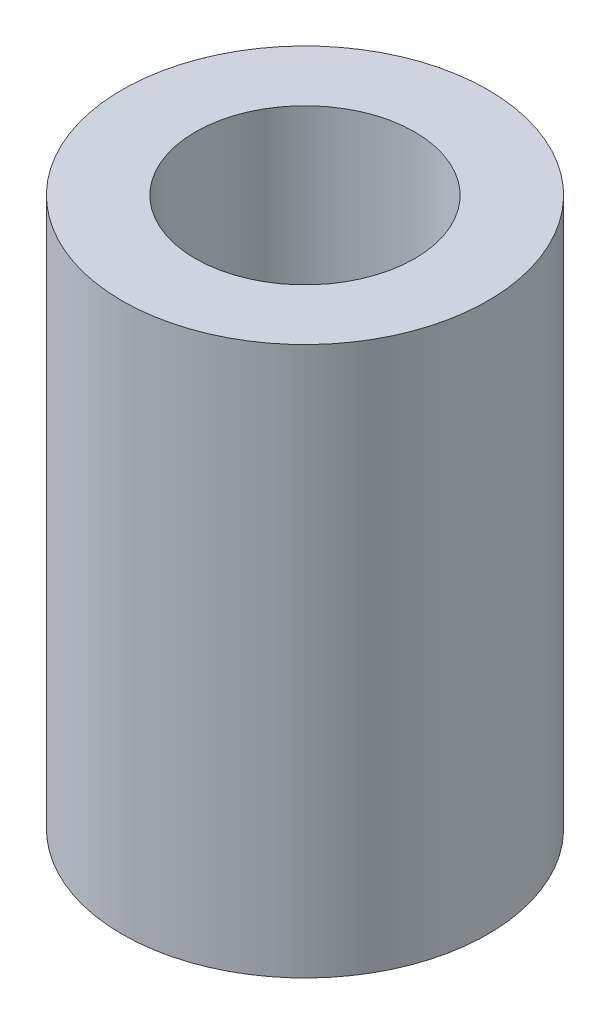
ISO-10303-21;
HEADER;
FILE_DESCRIPTION(('STEP AP214'),'2;1');
FILE_NAME('part.step','',(''),(''),'','','');
FILE_SCHEMA(('AUTOMOTIVE_DESIGN { 1 0 10303 214 1 1 1 1 }'));
ENDSEC;
DATA;
#1=APPLICATION_CONTEXT('core data for automotive mechanical design processes');
#2=APPLICATION_PROTOCOL_DEFINITION('international standard','automotive_design',2000,#1);
#3=PRODUCT_CONTEXT('',#1,'mechanical');
#4=PRODUCT('Part','Part','',(#3));
#5=PRODUCT_RELATED_PRODUCT_CATEGORY('part','',(#4));
#6=PRODUCT_DEFINITION_FORMATION('','',#4);
#7=PRODUCT_DEFINITION_CONTEXT('part definition',#1,'design');
#8=PRODUCT_DEFINITION('design','',#6,#7);
#9=PRODUCT_DEFINITION_SHAPE('','',#8);
#10=(LENGTH_UNIT() NAMED_UNIT(*) SI_UNIT(.MILLI.,.METRE.));
#11=(NAMED_UNIT(*) PLANE_ANGLE_UNIT() SI_UNIT($,.RADIAN.));
#12=(NAMED_UNIT(*) SI_UNIT($,.STERADIAN.) SOLID_ANGLE_UNIT());
#13=UNCERTAINTY_MEASURE_WITH_UNIT(LENGTH_MEASURE(1.E-05),#10,'distance_accuracy_value','');
#14=(GEOMETRIC_REPRESENTATION_CONTEXT(3) GLOBAL_UNCERTAINTY_ASSIGNED_CONTEXT((#13)) GLOBAL_UNIT_ASSIGNED_CONTEXT((#10,
#11,#12)) REPRESENTATION_CONTEXT('',''));
#15=CARTESIAN_POINT('',(0.,0.,0.));
#16=DIRECTION('',(0.,0.,1.));
#17=DIRECTION('',(1.,0.,0.));
#18=AXIS2_PLACEMENT_3D('',#15,#16,#17);
#19=CARTESIAN_POINT('',(0.,30.,0.));
#20=DIRECTION('',(0.,-1.,0.));
#21=DIRECTION('',(0.,0.,-1.));
#22=AXIS2_PLACEMENT_3D('',#19,#20,#21);
#23=CYLINDRICAL_SURFACE('',#22,10.);
#24=CARTESIAN_POINT('',(0.,30.,0.));
#25=DIRECTION('',(0.,1.,0.));
#26=DIRECTION('',(0.,0.,1.));
#27=AXIS2_PLACEMENT_3D('',#24,#25,#26);
#28=CIRCLE('',#27,10.);
#29=CARTESIAN_POINT('',(0.,30.,10.));
#30=VERTEX_POINT('',#29);
#31=EDGE_CURVE('E10',#30,#30,#28,.T.);
#32=ORIENTED_EDGE('',*,*,#31,.F.);
#33=EDGE_LOOP('',(#32));
#34=FACE_BOUND('',#33,.T.);
#35=CARTESIAN_POINT('',(0.,0.,0.));
#36=DIRECTION('',(0.,1.,0.));
#37=DIRECTION('',(0.,0.,1.));
#38=AXIS2_PLACEMENT_3D('',#35,#36,#37);
#39=CIRCLE('',#38,10.);
#40=CARTESIAN_POINT('',(0.,0.,10.));
#41=VERTEX_POINT('',#40);
#42=EDGE_CURVE('E40',#41,#41,#39,.T.);
#43=ORIENTED_EDGE('',*,*,#42,.T.);
#44=EDGE_LOOP('',(#43));
#45=FACE_BOUND('',#44,.T.);
#46=ADVANCED_FACE('F37',(#34,#45),#23,.T.);
#47=CARTESIAN_POINT('',(0.,30.,0.));
#48=DIRECTION('',(0.,1.,0.));
#49=DIRECTION('',(0.,0.,1.));
#50=AXIS2_PLACEMENT_3D('',#47,#48,#49);
#51=PLANE('',#50);
#52=CARTESIAN_POINT('',(0.,30.,0.));
#53=DIRECTION('',(0.,1.,0.));
#54=DIRECTION('',(0.,0.,1.));
#55=AXIS2_PLACEMENT_3D('',#52,#53,#54);
#56=CIRCLE('',#55,6.);
#57=CARTESIAN_POINT('',(0.,30.,6.));
#58=VERTEX_POINT('',#57);
#59=EDGE_CURVE('E51',#58,#58,#56,.T.);
#60=ORIENTED_EDGE('',*,*,#59,.F.);
#61=EDGE_LOOP('',(#60));
#62=FACE_BOUND('',#61,.T.);
#63=ORIENTED_EDGE('',*,*,#31,.T.);
#64=EDGE_LOOP('',(#63));
#65=FACE_BOUND('',#64,.T.);
#66=ADVANCED_FACE('F80',(#62,#65),#51,.T.);
#67=CARTESIAN_POINT('',(0.,0.,0.));
#68=DIRECTION('',(0.,1.,0.));
#69=DIRECTION('',(0.,0.,1.));
#70=AXIS2_PLACEMENT_3D('',#67,#68,#69);
#71=PLANE('',#70);
#72=CARTESIAN_POINT('',(0.,0.,0.));
#73=DIRECTION('',(0.,-1.,0.));
#74=DIRECTION('',(0.,0.,-1.));
#75=AXIS2_PLACEMENT_3D('',#72,#73,#74);
#76=CIRCLE('',#75,5.);
#77=CARTESIAN_POINT('',(0.,0.,-5.));
#78=VERTEX_POINT('',#77);
#79=EDGE_CURVE('E59',#78,#78,#76,.T.);
#80=ORIENTED_EDGE('',*,*,#79,.F.);
#81=EDGE_LOOP('',(#80));
#82=FACE_BOUND('',#81,.T.);
#83=ORIENTED_EDGE('',*,*,#42,.F.);
#84=EDGE_LOOP('',(#83));
#85=FACE_BOUND('',#84,.T.);
#86=ADVANCED_FACE('F76',(#82,#85),#71,.F.);
#87=CARTESIAN_POINT('',(0.,20.,0.));
#88=DIRECTION('',(0.,1.,0.));
#89=DIRECTION('',(0.,0.,1.));
#90=AXIS2_PLACEMENT_3D('',#87,#88,#89);
#91=CYLINDRICAL_SURFACE('',#90,6.);
#92=CARTESIAN_POINT('',(0.,20.,0.));
#93=DIRECTION('',(0.,1.,0.));
#94=DIRECTION('',(0.,0.,1.));
#95=AXIS2_PLACEMENT_3D('',#92,#93,#94);
#96=CIRCLE('',#95,6.);
#97=CARTESIAN_POINT('',(0.,20.,6.));
#98=VERTEX_POINT('',#97);
#99=EDGE_CURVE('E49',#98,#98,#96,.T.);
#100=ORIENTED_EDGE('',*,*,#99,.F.);
#101=EDGE_LOOP('',(#100));
#102=FACE_BOUND('',#101,.T.);
#103=ORIENTED_EDGE('',*,*,#59,.T.);
#104=EDGE_LOOP('',(#103));
#105=FACE_BOUND('',#104,.T.);
#106=ADVANCED_FACE('F79',(#102,#105),#91,.F.);
#107=CARTESIAN_POINT('',(0.,20.,0.));
#108=DIRECTION('',(0.,1.,0.));
#109=DIRECTION('',(0.,0.,1.));
#110=AXIS2_PLACEMENT_3D('',#107,#108,#109);
#111=PLANE('',#110);
#112=ORIENTED_EDGE('',*,*,#99,.T.);
#113=EDGE_LOOP('',(#112));
#114=FACE_BOUND('',#113,.T.);
#115=ADVANCED_FACE('F72',(#114),#111,.T.);
#116=CARTESIAN_POINT('',(0.,10.,0.));
#117=DIRECTION('',(0.,-1.,0.));
#118=DIRECTION('',(0.,0.,-1.));
#119=AXIS2_PLACEMENT_3D('',#116,#117,#118);
#120=CYLINDRICAL_SURFACE('',#119,5.);
#121=CARTESIAN_POINT('',(0.,10.,0.));
#122=DIRECTION('',(0.,-1.,0.));
#123=DIRECTION('',(0.,0.,-1.));
#124=AXIS2_PLACEMENT_3D('',#121,#122,#123);
#125=CIRCLE('',#124,5.);
#126=CARTESIAN_POINT('',(0.,10.,-5.));
#127=VERTEX_POINT('',#126);
#128=EDGE_CURVE('E55',#127,#127,#125,.T.);
#129=ORIENTED_EDGE('',*,*,#128,.F.);
#130=EDGE_LOOP('',(#129));
#131=FACE_BOUND('',#130,.T.);
#132=ORIENTED_EDGE('',*,*,#79,.T.);
#133=EDGE_LOOP('',(#132));
#134=FACE_BOUND('',#133,.T.);
#135=ADVANCED_FACE('F69',(#131,#134),#120,.F.);
#136=CARTESIAN_POINT('',(0.,10.,0.));
#137=DIRECTION('',(0.,-1.,0.));
#138=DIRECTION('',(0.,0.,-1.));
#139=AXIS2_PLACEMENT_3D('',#136,#137,#138);
#140=PLANE('',#139);
#141=ORIENTED_EDGE('',*,*,#128,.T.);
#142=EDGE_LOOP('',(#141));
#143=FACE_BOUND('',#142,.T.);
#144=ADVANCED_FACE('F67',(#143),#140,.T.);
#145=CLOSED_SHELL('',(#46,#66,#86,#106,#115,#135,#144));
#146=MANIFOLD_SOLID_BREP('B2',#145);
#147=ADVANCED_BREP_SHAPE_REPRESENTATION('',(#18,#146),#14);
#148=SHAPE_DEFINITION_REPRESENTATION(#9,#147);
ENDSEC;
END-ISO-10303-21;
